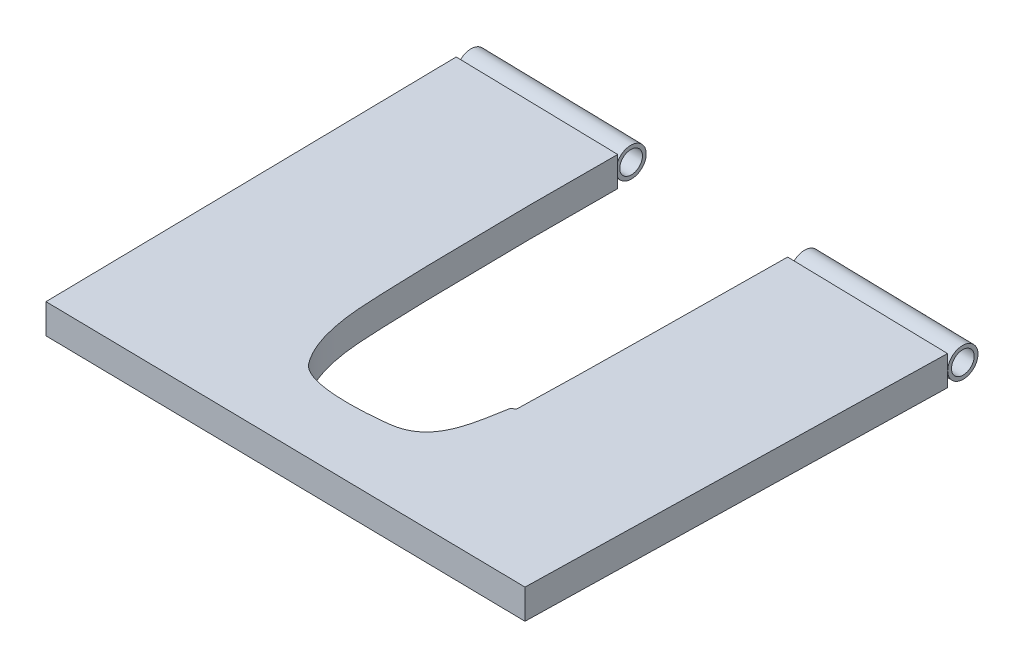
ISO-10303-21;
HEADER;
FILE_DESCRIPTION(('STEP AP214'),'2;1');
FILE_NAME('part.step','',(''),(''),'','','');
FILE_SCHEMA(('AUTOMOTIVE_DESIGN { 1 0 10303 214 1 1 1 1 }'));
ENDSEC;
DATA;
#1=APPLICATION_CONTEXT('core data for automotive mechanical design processes');
#2=APPLICATION_PROTOCOL_DEFINITION('international standard','automotive_design',2000,#1);
#3=PRODUCT_CONTEXT('',#1,'mechanical');
#4=PRODUCT('Part','Part','',(#3));
#5=PRODUCT_RELATED_PRODUCT_CATEGORY('part','',(#4));
#6=PRODUCT_DEFINITION_FORMATION('','',#4);
#7=PRODUCT_DEFINITION_CONTEXT('part definition',#1,'design');
#8=PRODUCT_DEFINITION('design','',#6,#7);
#9=PRODUCT_DEFINITION_SHAPE('','',#8);
#10=(LENGTH_UNIT() NAMED_UNIT(*) SI_UNIT(.MILLI.,.METRE.));
#11=(NAMED_UNIT(*) PLANE_ANGLE_UNIT() SI_UNIT($,.RADIAN.));
#12=(NAMED_UNIT(*) SI_UNIT($,.STERADIAN.) SOLID_ANGLE_UNIT());
#13=UNCERTAINTY_MEASURE_WITH_UNIT(LENGTH_MEASURE(1.E-05),#10,'distance_accuracy_value','');
#14=(GEOMETRIC_REPRESENTATION_CONTEXT(3) GLOBAL_UNCERTAINTY_ASSIGNED_CONTEXT((#13)) GLOBAL_UNIT_ASSIGNED_CONTEXT((#10,
#11,#12)) REPRESENTATION_CONTEXT('',''));
#15=CARTESIAN_POINT('',(0.,0.,0.));
#16=DIRECTION('',(0.,0.,1.));
#17=DIRECTION('',(1.,0.,0.));
#18=AXIS2_PLACEMENT_3D('',#15,#16,#17);
#19=CARTESIAN_POINT('',(37.3754746862016,33.8245708952093,45.8403136870538));
#20=DIRECTION('',(-0.99975317783161,0.,-0.0222167372851469));
#21=DIRECTION('',(0.0167074672385724,0.659138415618701,-0.751836025735759));
#22=AXIS2_PLACEMENT_3D('',#19,#20,#21);
#23=CYLINDRICAL_SURFACE('',#22,0.5);
#24=CARTESIAN_POINT('',(19.6098607161339,33.8245708952093,45.4455222654968));
#25=DIRECTION('',(0.99975317783161,0.,0.0222167372851469));
#26=DIRECTION('',(-0.0167074672385724,-0.659138415618701,0.751836025735759));
#27=AXIS2_PLACEMENT_3D('',#24,#25,#26);
#28=CIRCLE('',#27,0.5);
#29=CARTESIAN_POINT('',(19.6015069825146,33.4950016873999,45.8214402783646));
#30=VERTEX_POINT('',#29);
#31=EDGE_CURVE('P0_E56',#30,#30,#28,.T.);
#32=ORIENTED_EDGE('',*,*,#31,.T.);
#33=EDGE_LOOP('',(#32));
#34=FACE_BOUND('',#33,.T.);
#35=CARTESIAN_POINT('',(25.1249778431293,33.8245708952093,45.5680804238744));
#36=DIRECTION('',(-0.99975317783161,0.,-0.0222167372851479));
#37=DIRECTION('',(-0.0222167372851479,0.,0.99975317783161));
#38=AXIS2_PLACEMENT_3D('',#35,#36,#37);
#39=CIRCLE('',#38,0.5);
#40=CARTESIAN_POINT('',(25.1138694744868,33.8245708952093,46.0679570127902));
#41=VERTEX_POINT('',#40);
#42=EDGE_CURVE('P0_E46',#41,#41,#39,.T.);
#43=ORIENTED_EDGE('',*,*,#42,.T.);
#44=EDGE_LOOP('',(#43));
#45=FACE_BOUND('',#44,.T.);
#46=ADVANCED_FACE('P0_F42',(#34,#45),#23,.T.);
#47=CARTESIAN_POINT('',(37.3754746862016,33.8245708952093,45.8403136870538));
#48=DIRECTION('',(-0.99975317783161,0.,-0.0222167372851469));
#49=DIRECTION('',(0.0167074672385724,0.659138415618701,-0.751836025735759));
#50=AXIS2_PLACEMENT_3D('',#47,#48,#49);
#51=CYLINDRICAL_SURFACE('',#50,0.375);
#52=CARTESIAN_POINT('',(25.1249778431293,33.8245708952093,45.5680804238744));
#53=DIRECTION('',(-0.99975317783161,0.,-0.0222167372851479));
#54=DIRECTION('',(-0.0222167372851479,0.,0.99975317783161));
#55=AXIS2_PLACEMENT_3D('',#52,#53,#54);
#56=CIRCLE('',#55,0.375);
#57=CARTESIAN_POINT('',(25.1166465666474,33.8245708952093,45.9429878655613));
#58=VERTEX_POINT('',#57);
#59=EDGE_CURVE('P0_E11',#58,#58,#56,.T.);
#60=ORIENTED_EDGE('',*,*,#59,.F.);
#61=EDGE_LOOP('',(#60));
#62=FACE_BOUND('',#61,.T.);
#63=CARTESIAN_POINT('',(19.6098607161339,33.8245708952093,45.4455222654968));
#64=DIRECTION('',(0.99975317783161,0.,0.0222167372851469));
#65=DIRECTION('',(-0.0167074672385724,-0.659138415618701,0.751836025735759));
#66=AXIS2_PLACEMENT_3D('',#63,#64,#65);
#67=CIRCLE('',#66,0.375);
#68=CARTESIAN_POINT('',(19.6035954159195,33.5773939893523,45.7274607751477));
#69=VERTEX_POINT('',#68);
#70=EDGE_CURVE('P0_E50',#69,#69,#67,.T.);
#71=ORIENTED_EDGE('',*,*,#70,.F.);
#72=EDGE_LOOP('',(#71));
#73=FACE_BOUND('',#72,.T.);
#74=ADVANCED_FACE('P0_F44',(#62,#73),#51,.F.);
#75=CARTESIAN_POINT('',(19.6098607161339,33.8245708952093,45.4455222654968));
#76=DIRECTION('',(0.99975317783161,0.,0.0222167372851469));
#77=DIRECTION('',(-0.0167074672385724,-0.659138415618701,0.751836025735759));
#78=AXIS2_PLACEMENT_3D('',#75,#76,#77);
#79=PLANE('',#78);
#80=ORIENTED_EDGE('',*,*,#31,.F.);
#81=EDGE_LOOP('',(#80));
#82=FACE_BOUND('',#81,.T.);
#83=ORIENTED_EDGE('',*,*,#70,.T.);
#84=EDGE_LOOP('',(#83));
#85=FACE_BOUND('',#84,.T.);
#86=ADVANCED_FACE('P0_F66',(#82,#85),#79,.F.);
#87=CARTESIAN_POINT('',(25.1138694744868,33.0164708952092,46.0679570127902));
#88=DIRECTION('',(-0.99975317783161,0.,-0.0222167372851479));
#89=DIRECTION('',(-0.0222167372851479,0.,0.99975317783161));
#90=AXIS2_PLACEMENT_3D('',#87,#88,#89);
#91=PLANE('',#90);
#92=ORIENTED_EDGE('',*,*,#59,.T.);
#93=EDGE_LOOP('',(#92));
#94=FACE_BOUND('',#93,.T.);
#95=ORIENTED_EDGE('',*,*,#42,.F.);
#96=EDGE_LOOP('',(#95));
#97=FACE_BOUND('',#96,.T.);
#98=ADVANCED_FACE('P0_F64',(#94,#97),#91,.F.);
#99=CLOSED_SHELL('',(#46,#74,#86,#98));
#100=MANIFOLD_SOLID_BREP('P0_B2',#99);
#101=CARTESIAN_POINT('',(37.3754746862016,33.8245708952093,45.8403136870538));
#102=DIRECTION('',(-0.99975317783161,0.,-0.0222167372851469));
#103=DIRECTION('',(0.0167074672385724,0.659138415618701,-0.751836025735759));
#104=AXIS2_PLACEMENT_3D('',#101,#102,#103);
#105=CYLINDRICAL_SURFACE('',#104,0.5);
#106=CARTESIAN_POINT('',(31.123496910119,33.8245708952093,45.7013808475853));
#107=DIRECTION('',(0.99975317783161,0.,0.0222167372851464));
#108=DIRECTION('',(0.0222167372851464,0.,-0.99975317783161));
#109=AXIS2_PLACEMENT_3D('',#106,#107,#108);
#110=CIRCLE('',#109,0.5);
#111=CARTESIAN_POINT('',(31.1346052787616,33.8245708952093,45.2015042586695));
#112=VERTEX_POINT('',#111);
#113=EDGE_CURVE('P0_E115',#112,#112,#110,.T.);
#114=ORIENTED_EDGE('',*,*,#113,.T.);
#115=EDGE_LOOP('',(#114));
#116=FACE_BOUND('',#115,.T.);
#117=CARTESIAN_POINT('',(36.5755721686186,33.8245708952093,45.822538075552));
#118=DIRECTION('',(-0.99975317783161,0.,-0.0222167372851431));
#119=DIRECTION('',(-0.0222167372851431,0.,0.99975317783161));
#120=AXIS2_PLACEMENT_3D('',#117,#118,#119);
#121=CIRCLE('',#120,0.5);
#122=CARTESIAN_POINT('',(36.564463799976,33.8245708952093,46.3224146644678));
#123=VERTEX_POINT('',#122);
#124=EDGE_CURVE('P0_E41',#123,#123,#121,.T.);
#125=ORIENTED_EDGE('',*,*,#124,.T.);
#126=EDGE_LOOP('',(#125));
#127=FACE_BOUND('',#126,.T.);
#128=ADVANCED_FACE('P0_F103',(#116,#127),#105,.T.);
#129=CARTESIAN_POINT('',(37.5752950912399,0.,0.835006557582962));
#130=DIRECTION('',(-0.99975317783161,0.,-0.0222167372851431));
#131=DIRECTION('',(-0.0222167372851431,0.,0.99975317783161));
#132=AXIS2_PLACEMENT_3D('',#129,#130,#131);
#133=PLANE('',#132);
#134=CARTESIAN_POINT('',(36.5755721686186,33.8245708952093,45.822538075552));
#135=DIRECTION('',(-0.99975317783161,0.,-0.0222167372851431));
#136=DIRECTION('',(-0.0222167372851431,0.,0.99975317783161));
#137=AXIS2_PLACEMENT_3D('',#134,#135,#136);
#138=CIRCLE('',#137,0.375);
#139=CARTESIAN_POINT('',(36.5672408921367,33.8245708952093,46.1974455172388));
#140=VERTEX_POINT('',#139);
#141=EDGE_CURVE('P0_E110',#140,#140,#138,.T.);
#142=ORIENTED_EDGE('',*,*,#141,.T.);
#143=EDGE_LOOP('',(#142));
#144=FACE_BOUND('',#143,.T.);
#145=ORIENTED_EDGE('',*,*,#124,.F.);
#146=EDGE_LOOP('',(#145));
#147=FACE_BOUND('',#146,.T.);
#148=ADVANCED_FACE('P0_F129',(#144,#147),#133,.F.);
#149=CARTESIAN_POINT('',(37.3754746862016,33.8245708952093,45.8403136870538));
#150=DIRECTION('',(-0.99975317783161,0.,-0.0222167372851469));
#151=DIRECTION('',(0.0167074672385724,0.659138415618701,-0.751836025735759));
#152=AXIS2_PLACEMENT_3D('',#149,#150,#151);
#153=CYLINDRICAL_SURFACE('',#152,0.375);
#154=CARTESIAN_POINT('',(31.123496910119,33.8245708952093,45.7013808475853));
#155=DIRECTION('',(0.99975317783161,0.,0.0222167372851464));
#156=DIRECTION('',(0.0222167372851464,0.,-0.99975317783161));
#157=AXIS2_PLACEMENT_3D('',#154,#155,#156);
#158=CIRCLE('',#157,0.375);
#159=CARTESIAN_POINT('',(31.1318281866009,33.8245708952093,45.3264734058985));
#160=VERTEX_POINT('',#159);
#161=EDGE_CURVE('P0_E106',#160,#160,#158,.T.);
#162=ORIENTED_EDGE('',*,*,#161,.F.);
#163=EDGE_LOOP('',(#162));
#164=FACE_BOUND('',#163,.T.);
#165=ORIENTED_EDGE('',*,*,#141,.F.);
#166=EDGE_LOOP('',(#165));
#167=FACE_BOUND('',#166,.T.);
#168=ADVANCED_FACE('P0_F126',(#164,#167),#153,.F.);
#169=CARTESIAN_POINT('',(31.1682679745433,33.0164708952092,43.6866829484915));
#170=DIRECTION('',(0.99975317783161,0.,0.0222167372851464));
#171=DIRECTION('',(0.0222167372851464,0.,-0.99975317783161));
#172=AXIS2_PLACEMENT_3D('',#169,#170,#171);
#173=PLANE('',#172);
#174=ORIENTED_EDGE('',*,*,#161,.T.);
#175=EDGE_LOOP('',(#174));
#176=FACE_BOUND('',#175,.T.);
#177=ORIENTED_EDGE('',*,*,#113,.F.);
#178=EDGE_LOOP('',(#177));
#179=FACE_BOUND('',#178,.T.);
#180=ADVANCED_FACE('P0_F123',(#176,#179),#173,.F.);
#181=CLOSED_SHELL('',(#128,#148,#168,#180));
#182=MANIFOLD_SOLID_BREP('P0_B6',#181);
#183=CARTESIAN_POINT('',(19.8285585855502,34.3245708952092,60.0180910491357));
#184=DIRECTION('',(0.999866385580923,0.,-0.0163465894100423));
#185=DIRECTION('',(-0.0163465894100423,0.,-0.999866385580923));
#186=AXIS2_PLACEMENT_3D('',#183,#184,#185);
#187=PLANE('',#186);
#188=DIRECTION('',(0.0163465894100423,0.,0.999866385580923));
#189=VECTOR('',#188,1.);
#190=CARTESIAN_POINT('',(19.8285585855502,34.3245708952092,60.0180910491357));
#191=LINE('',#190,#189);
#192=CARTESIAN_POINT('',(19.5984872271913,34.3245708952092,45.9453929628503));
#193=VERTEX_POINT('',#192);
#194=CARTESIAN_POINT('',(19.8285585855502,34.3245708952092,60.0180910491357));
#195=VERTEX_POINT('',#194);
#196=EDGE_CURVE('P1_E91',#193,#195,#191,.T.);
#197=ORIENTED_EDGE('',*,*,#196,.F.);
#198=DIRECTION('',(0.,-1.,0.));
#199=VECTOR('',#198,1.);
#200=CARTESIAN_POINT('',(19.5984872271913,34.3245708952092,45.9453929628503));
#201=LINE('',#200,#199);
#202=CARTESIAN_POINT('',(19.5984872271913,33.3245708952092,45.9453929628503));
#203=VERTEX_POINT('',#202);
#204=EDGE_CURVE('P1_E78',#193,#203,#201,.T.);
#205=ORIENTED_EDGE('',*,*,#204,.T.);
#206=DIRECTION('',(0.0163465894100423,0.,0.999866385580923));
#207=VECTOR('',#206,1.);
#208=CARTESIAN_POINT('',(19.8285585855502,33.3245708952092,60.0180910491357));
#209=LINE('',#208,#207);
#210=CARTESIAN_POINT('',(19.8285585855502,33.3245708952092,60.0180910491357));
#211=VERTEX_POINT('',#210);
#212=EDGE_CURVE('P1_E86',#203,#211,#209,.T.);
#213=ORIENTED_EDGE('',*,*,#212,.T.);
#214=DIRECTION('',(0.,-1.,0.));
#215=VECTOR('',#214,1.);
#216=CARTESIAN_POINT('',(19.8285585855502,34.3245708952092,60.0180910491357));
#217=LINE('',#216,#215);
#218=EDGE_CURVE('P1_E99',#195,#211,#217,.T.);
#219=ORIENTED_EDGE('',*,*,#218,.F.);
#220=EDGE_LOOP('',(#197,#205,#213,#219));
#221=FACE_BOUND('',#220,.T.);
#222=ADVANCED_FACE('P1_F23',(#221),#187,.F.);
#223=CARTESIAN_POINT('',(-6.01565351425732,34.3245708952092,1.74622374625626));
#224=DIRECTION('',(0.,1.,0.));
#225=DIRECTION('',(0.,0.,1.));
#226=AXIS2_PLACEMENT_3D('',#223,#224,#225);
#227=PLANE('',#226);
#228=DIRECTION('',(0.99975317783161,0.,0.022216737285147));
#229=VECTOR('',#228,1.);
#230=CARTESIAN_POINT('',(37.5783501658114,34.3245708952092,46.3449454725974));
#231=LINE('',#230,#229);
#232=CARTESIAN_POINT('',(25.1734298877545,34.3245708952092,46.0692805775295));
#233=VERTEX_POINT('',#232);
#234=EDGE_CURVE('P1_E42',#193,#233,#231,.T.);
#235=ORIENTED_EDGE('',*,*,#234,.F.);
#236=ORIENTED_EDGE('',*,*,#196,.T.);
#237=DIRECTION('',(0.999874047483599,0.,0.0158710166267237));
#238=VECTOR('',#237,1.);
#239=CARTESIAN_POINT('',(36.2542606362267,34.3245708952092,60.2788164785115));
#240=LINE('',#239,#238);
#241=CARTESIAN_POINT('',(36.2542606362267,34.3245708952092,60.2788164785115));
#242=VERTEX_POINT('',#241);
#243=EDGE_CURVE('P1_E102',#195,#242,#240,.T.);
#244=ORIENTED_EDGE('',*,*,#243,.T.);
#245=DIRECTION('',(0.0217339954092151,0.,-0.999763788823916));
#246=VECTOR('',#245,1.);
#247=CARTESIAN_POINT('',(36.6453487802904,34.3245708952092,42.2887618515802));
#248=LINE('',#247,#246);
#249=CARTESIAN_POINT('',(36.557663960609,34.3245708952092,46.3222635569263));
#250=VERTEX_POINT('',#249);
#251=EDGE_CURVE('P1_E107',#242,#250,#248,.T.);
#252=ORIENTED_EDGE('',*,*,#251,.T.);
#253=CARTESIAN_POINT('',(31.0397520487104,34.3245708952092,46.1996432922174));
#254=VERTEX_POINT('',#253);
#255=EDGE_CURVE('P1_E96',#254,#250,#231,.T.);
#256=ORIENTED_EDGE('',*,*,#255,.F.);
#257=CARTESIAN_POINT('',(25.1734298877545,34.3245708952092,46.0692805775295));
#258=CARTESIAN_POINT('',(25.1734298877545,34.3245708952092,47.2425450097207));
#259=CARTESIAN_POINT('',(25.155920428473,34.3245708952092,48.4159401022421));
#260=CARTESIAN_POINT('',(25.1734298877545,34.3245708952092,49.589073874103));
#261=CARTESIAN_POINT('',(25.1993779323957,34.3245708952092,51.3275928650668));
#262=CARTESIAN_POINT('',(25.2036487798688,34.3245708952092,53.0677562036768));
#263=CARTESIAN_POINT('',(25.3037926024424,34.3245708952092,54.8035824616194));
#264=CARTESIAN_POINT('',(25.3515964490307,34.3245708952092,55.6321824691496));
#265=CARTESIAN_POINT('',(25.5316220317833,34.3245708952092,56.7179031818943));
#266=CARTESIAN_POINT('',(26.0859688905698,34.3245708952092,57.4108367553775));
#267=CARTESIAN_POINT('',(26.679555771768,34.3245708952092,58.1528203568752));
#268=CARTESIAN_POINT('',(29.1481071244235,34.3245708952092,57.80991292968));
#269=CARTESIAN_POINT('',(29.2146740430796,34.3245708952092,57.8019248994413));
#270=CARTESIAN_POINT('',(30.5213832163834,34.3245708952092,57.6451197986448));
#271=CARTESIAN_POINT('',(30.5946385061197,34.3245708952092,56.2469738864454));
#272=CARTESIAN_POINT('',(30.7790266193345,34.3245708952092,55.325033320371));
#273=CARTESIAN_POINT('',(30.7910786565708,34.3245708952092,55.2647731341895));
#274=CARTESIAN_POINT('',(30.907634233871,34.3245708952092,55.2560991109851));
#275=CARTESIAN_POINT('',(30.9093893340224,34.3245708952092,55.1946706056831));
#276=CARTESIAN_POINT('',(30.9950303087127,34.3245708952092,52.1972364915251));
#277=CARTESIAN_POINT('',(30.9962978104811,34.3245708952092,49.1979857300393));
#278=CARTESIAN_POINT('',(31.0397520487104,34.3245708952092,46.1996432922174));
#279=B_SPLINE_CURVE_WITH_KNOTS('',3,(#257,#258,#259,#260,#261,#262,#263,#264,#265,#266,#267,
#268,#269,#270,#271,#272,#273,#274,#275,#276,#277,#278),.UNSPECIFIED.,.F.,.F.,(4,3,3,3,3,3,3,4),
(0.,1.,2.,3.,4.,5.,6.,7.),.UNSPECIFIED.);
#280=EDGE_CURVE('P1_E26',#233,#254,#279,.T.);
#281=ORIENTED_EDGE('',*,*,#280,.F.);
#282=EDGE_LOOP('',(#235,#236,#244,#252,#256,#281));
#283=FACE_BOUND('',#282,.T.);
#284=ADVANCED_FACE('P1_F90',(#283),#227,.T.);
#285=CARTESIAN_POINT('',(-6.01565351425732,33.3245708952092,1.74622374625626));
#286=DIRECTION('',(0.,1.,0.));
#287=DIRECTION('',(0.,0.,1.));
#288=AXIS2_PLACEMENT_3D('',#285,#286,#287);
#289=PLANE('',#288);
#290=ORIENTED_EDGE('',*,*,#212,.F.);
#291=DIRECTION('',(0.99975317783161,0.,0.022216737285147));
#292=VECTOR('',#291,1.);
#293=CARTESIAN_POINT('',(-6.98472976006447,33.3245708952092,45.354654807578));
#294=LINE('',#293,#292);
#295=CARTESIAN_POINT('',(25.1734298877545,33.3245708952092,46.0692805775295));
#296=VERTEX_POINT('',#295);
#297=EDGE_CURVE('P1_E81',#203,#296,#294,.T.);
#298=ORIENTED_EDGE('',*,*,#297,.T.);
#299=CARTESIAN_POINT('',(25.1734298877545,33.3245708952092,46.0692805775295));
#300=CARTESIAN_POINT('',(25.1734298877545,33.3245708952092,47.2425450097207));
#301=CARTESIAN_POINT('',(25.155920428473,33.3245708952092,48.4159401022421));
#302=CARTESIAN_POINT('',(25.1734298877545,33.3245708952092,49.589073874103));
#303=CARTESIAN_POINT('',(25.1993779323957,33.3245708952092,51.3275928650668));
#304=CARTESIAN_POINT('',(25.2036487798688,33.3245708952092,53.0677562036768));
#305=CARTESIAN_POINT('',(25.3037926024424,33.3245708952092,54.8035824616194));
#306=CARTESIAN_POINT('',(25.3515964490307,33.3245708952092,55.6321824691496));
#307=CARTESIAN_POINT('',(25.5316220317833,33.3245708952092,56.7179031818943));
#308=CARTESIAN_POINT('',(26.0859688905698,33.3245708952092,57.4108367553775));
#309=CARTESIAN_POINT('',(26.679555771768,33.3245708952092,58.1528203568752));
#310=CARTESIAN_POINT('',(29.1481071244235,33.3245708952092,57.80991292968));
#311=CARTESIAN_POINT('',(29.2146740430796,33.3245708952092,57.8019248994413));
#312=CARTESIAN_POINT('',(30.5213832163834,33.3245708952092,57.6451197986448));
#313=CARTESIAN_POINT('',(30.5946385061197,33.3245708952092,56.2469738864454));
#314=CARTESIAN_POINT('',(30.7790266193345,33.3245708952092,55.325033320371));
#315=CARTESIAN_POINT('',(30.7910786565708,33.3245708952092,55.2647731341895));
#316=CARTESIAN_POINT('',(30.907634233871,33.3245708952092,55.2560991109851));
#317=CARTESIAN_POINT('',(30.9093893340224,33.3245708952092,55.1946706056831));
#318=CARTESIAN_POINT('',(30.9950303087127,33.3245708952092,52.1972364915251));
#319=CARTESIAN_POINT('',(30.9962978104811,33.3245708952092,49.1979857300393));
#320=CARTESIAN_POINT('',(31.0397520487104,33.3245708952092,46.1996432922174));
#321=B_SPLINE_CURVE_WITH_KNOTS('',3,(#299,#300,#301,#302,#303,#304,#305,#306,#307,#308,#309,
#310,#311,#312,#313,#314,#315,#316,#317,#318,#319,#320),.UNSPECIFIED.,.F.,.F.,(4,3,3,3,3,3,3,4),
(0.,1.,2.,3.,4.,5.,6.,7.),.UNSPECIFIED.);
#322=CARTESIAN_POINT('',(31.0397520487104,33.3245708952092,46.1996432922174));
#323=VERTEX_POINT('',#322);
#324=EDGE_CURVE('P1_E113',#296,#323,#321,.T.);
#325=ORIENTED_EDGE('',*,*,#324,.T.);
#326=CARTESIAN_POINT('',(36.557663960609,33.3245708952092,46.3222635569263));
#327=VERTEX_POINT('',#326);
#328=EDGE_CURVE('P1_E50',#323,#327,#294,.T.);
#329=ORIENTED_EDGE('',*,*,#328,.T.);
#330=DIRECTION('',(0.0217339954092151,0.,-0.999763788823916));
#331=VECTOR('',#330,1.);
#332=CARTESIAN_POINT('',(36.6453487802904,33.3245708952092,42.2887618515802));
#333=LINE('',#332,#331);
#334=CARTESIAN_POINT('',(36.2542606362267,33.3245708952092,60.2788164785115));
#335=VERTEX_POINT('',#334);
#336=EDGE_CURVE('P1_E130',#335,#327,#333,.T.);
#337=ORIENTED_EDGE('',*,*,#336,.F.);
#338=DIRECTION('',(0.999874047483599,0.,0.0158710166267237));
#339=VECTOR('',#338,1.);
#340=CARTESIAN_POINT('',(36.2542606362267,33.3245708952092,60.2788164785115));
#341=LINE('',#340,#339);
#342=EDGE_CURVE('P1_E118',#211,#335,#341,.T.);
#343=ORIENTED_EDGE('',*,*,#342,.F.);
#344=EDGE_LOOP('',(#290,#298,#325,#329,#337,#343));
#345=FACE_BOUND('',#344,.T.);
#346=ADVANCED_FACE('P1_F152',(#345),#289,.F.);
#347=CARTESIAN_POINT('',(36.2542606362267,34.3245708952092,60.2788164785115));
#348=DIRECTION('',(0.0158710166267237,0.,-0.999874047483599));
#349=DIRECTION('',(-0.999874047483599,0.,-0.0158710166267237));
#350=AXIS2_PLACEMENT_3D('',#347,#348,#349);
#351=PLANE('',#350);
#352=ORIENTED_EDGE('',*,*,#342,.T.);
#353=DIRECTION('',(0.,-1.,0.));
#354=VECTOR('',#353,1.);
#355=CARTESIAN_POINT('',(36.2542606362267,34.3245708952092,60.2788164785115));
#356=LINE('',#355,#354);
#357=EDGE_CURVE('P1_E134',#242,#335,#356,.T.);
#358=ORIENTED_EDGE('',*,*,#357,.F.);
#359=ORIENTED_EDGE('',*,*,#243,.F.);
#360=ORIENTED_EDGE('',*,*,#218,.T.);
#361=EDGE_LOOP('',(#352,#358,#359,#360));
#362=FACE_BOUND('',#361,.T.);
#363=ADVANCED_FACE('P1_F154',(#362),#351,.F.);
#364=CARTESIAN_POINT('',(36.6453487802904,34.3245708952092,42.2887618515802));
#365=DIRECTION('',(-0.999763788823916,0.,-0.0217339954092151));
#366=DIRECTION('',(-0.0217339954092151,0.,0.999763788823916));
#367=AXIS2_PLACEMENT_3D('',#364,#365,#366);
#368=PLANE('',#367);
#369=ORIENTED_EDGE('',*,*,#336,.T.);
#370=DIRECTION('',(0.,1.,0.));
#371=VECTOR('',#370,1.);
#372=CARTESIAN_POINT('',(36.557663960609,34.3245708952092,46.3222635569263));
#373=LINE('',#372,#371);
#374=EDGE_CURVE('P1_E140',#327,#250,#373,.T.);
#375=ORIENTED_EDGE('',*,*,#374,.T.);
#376=ORIENTED_EDGE('',*,*,#251,.F.);
#377=ORIENTED_EDGE('',*,*,#357,.T.);
#378=EDGE_LOOP('',(#369,#375,#376,#377));
#379=FACE_BOUND('',#378,.T.);
#380=ADVANCED_FACE('P1_F148',(#379),#368,.F.);
#381=DIRECTION('',(0.,-1.,0.));
#382=VECTOR('',#381,1.);
#383=SURFACE_OF_LINEAR_EXTRUSION('',#279,#382);
#384=ORIENTED_EDGE('',*,*,#324,.F.);
#385=DIRECTION('',(0.,-1.,0.));
#386=VECTOR('',#385,1.);
#387=CARTESIAN_POINT('',(25.1734298877545,34.3245708952092,46.0692805775295));
#388=LINE('',#387,#386);
#389=EDGE_CURVE('P1_E13',#233,#296,#388,.T.);
#390=ORIENTED_EDGE('',*,*,#389,.F.);
#391=ORIENTED_EDGE('',*,*,#280,.T.);
#392=DIRECTION('',(0.,-1.,0.));
#393=VECTOR('',#392,1.);
#394=CARTESIAN_POINT('',(31.0397520487104,34.3245708952092,46.1996432922174));
#395=LINE('',#394,#393);
#396=EDGE_CURVE('P1_E35',#254,#323,#395,.T.);
#397=ORIENTED_EDGE('',*,*,#396,.T.);
#398=EDGE_LOOP('',(#384,#390,#391,#397));
#399=FACE_BOUND('',#398,.T.);
#400=ADVANCED_FACE('P1_F162',(#399),#383,.T.);
#401=CARTESIAN_POINT('',(37.5783501658114,24.3245708952092,46.3449454725974));
#402=DIRECTION('',(-0.022216737285147,0.,0.99975317783161));
#403=DIRECTION('',(0.99975317783161,0.,0.022216737285147));
#404=AXIS2_PLACEMENT_3D('',#401,#402,#403);
#405=PLANE('',#404);
#406=ORIENTED_EDGE('',*,*,#328,.F.);
#407=ORIENTED_EDGE('',*,*,#396,.F.);
#408=ORIENTED_EDGE('',*,*,#255,.T.);
#409=ORIENTED_EDGE('',*,*,#374,.F.);
#410=EDGE_LOOP('',(#406,#407,#408,#409));
#411=FACE_BOUND('',#410,.T.);
#412=ADVANCED_FACE('P1_F146',(#411),#405,.F.);
#413=ORIENTED_EDGE('',*,*,#234,.T.);
#414=ORIENTED_EDGE('',*,*,#389,.T.);
#415=ORIENTED_EDGE('',*,*,#297,.F.);
#416=ORIENTED_EDGE('',*,*,#204,.F.);
#417=EDGE_LOOP('',(#413,#414,#415,#416));
#418=FACE_BOUND('',#417,.T.);
#419=ADVANCED_FACE('P1_F79',(#418),#405,.F.);
#420=CLOSED_SHELL('',(#222,#284,#346,#363,#380,#400,#412,#419));
#421=MANIFOLD_SOLID_BREP('P1_B1',#420);
#422=ADVANCED_BREP_SHAPE_REPRESENTATION('',(#18,#100,#182,#421),#14);
#423=SHAPE_DEFINITION_REPRESENTATION(#9,#422);
ENDSEC;
END-ISO-10303-21;
